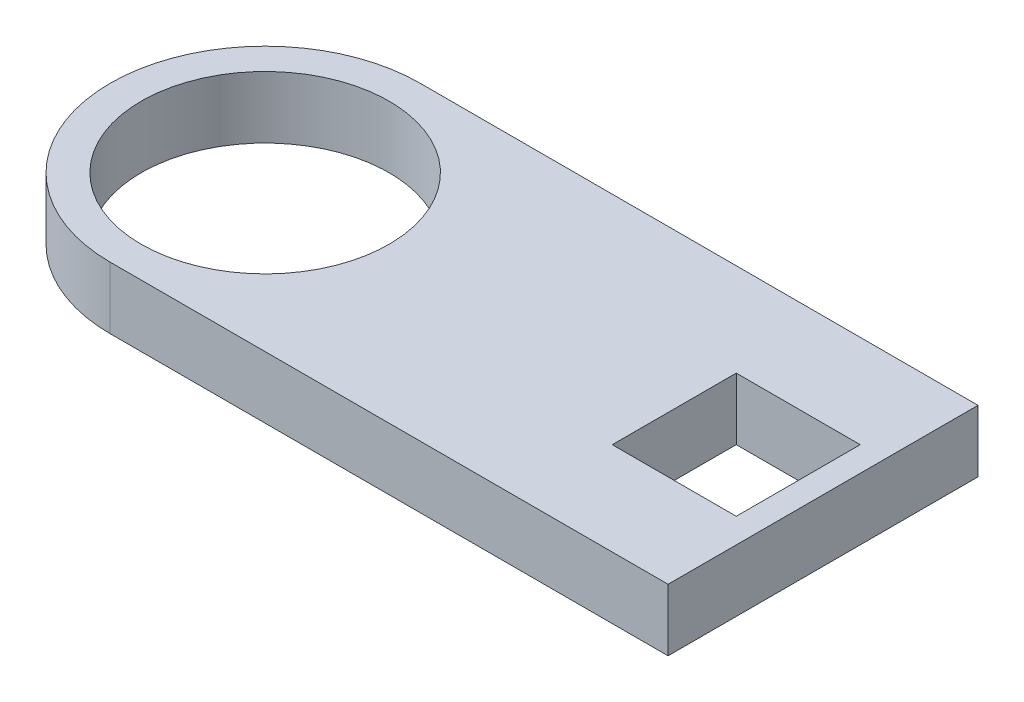
ISO-10303-21;
HEADER;
FILE_DESCRIPTION(('STEP AP214'),'2;1');
FILE_NAME('part.step','',(''),(''),'','','');
FILE_SCHEMA(('AUTOMOTIVE_DESIGN { 1 0 10303 214 1 1 1 1 }'));
ENDSEC;
DATA;
#1=APPLICATION_CONTEXT('core data for automotive mechanical design processes');
#2=APPLICATION_PROTOCOL_DEFINITION('international standard','automotive_design',2000,#1);
#3=PRODUCT_CONTEXT('',#1,'mechanical');
#4=PRODUCT('Part','Part','',(#3));
#5=PRODUCT_RELATED_PRODUCT_CATEGORY('part','',(#4));
#6=PRODUCT_DEFINITION_FORMATION('','',#4);
#7=PRODUCT_DEFINITION_CONTEXT('part definition',#1,'design');
#8=PRODUCT_DEFINITION('design','',#6,#7);
#9=PRODUCT_DEFINITION_SHAPE('','',#8);
#10=(LENGTH_UNIT() NAMED_UNIT(*) SI_UNIT(.MILLI.,.METRE.));
#11=(NAMED_UNIT(*) PLANE_ANGLE_UNIT() SI_UNIT($,.RADIAN.));
#12=(NAMED_UNIT(*) SI_UNIT($,.STERADIAN.) SOLID_ANGLE_UNIT());
#13=UNCERTAINTY_MEASURE_WITH_UNIT(LENGTH_MEASURE(1.E-05),#10,'distance_accuracy_value','');
#14=(GEOMETRIC_REPRESENTATION_CONTEXT(3) GLOBAL_UNCERTAINTY_ASSIGNED_CONTEXT((#13)) GLOBAL_UNIT_ASSIGNED_CONTEXT((#10,
#11,#12)) REPRESENTATION_CONTEXT('',''));
#15=CARTESIAN_POINT('',(0.,0.,0.));
#16=DIRECTION('',(0.,0.,1.));
#17=DIRECTION('',(1.,0.,0.));
#18=AXIS2_PLACEMENT_3D('',#15,#16,#17);
#19=CARTESIAN_POINT('',(0.,5.,-12.5));
#20=DIRECTION('',(0.,1.,0.));
#21=DIRECTION('',(0.,0.,1.));
#22=AXIS2_PLACEMENT_3D('',#19,#20,#21);
#23=PLANE('',#22);
#24=CARTESIAN_POINT('',(0.,5.,-12.5));
#25=DIRECTION('',(0.,1.,0.));
#26=DIRECTION('',(0.,0.,1.));
#27=AXIS2_PLACEMENT_3D('',#24,#25,#26);
#28=CIRCLE('',#27,12.5);
#29=CARTESIAN_POINT('',(0.,5.,-25.));
#30=VERTEX_POINT('',#29);
#31=CARTESIAN_POINT('',(0.,5.,0.));
#32=VERTEX_POINT('',#31);
#33=EDGE_CURVE('E140',#30,#32,#28,.T.);
#34=ORIENTED_EDGE('',*,*,#33,.T.);
#35=DIRECTION('',(1.,0.,0.));
#36=VECTOR('',#35,1.);
#37=CARTESIAN_POINT('',(0.,5.,0.));
#38=LINE('',#37,#36);
#39=CARTESIAN_POINT('',(45.,5.,0.));
#40=VERTEX_POINT('',#39);
#41=EDGE_CURVE('E143',#32,#40,#38,.T.);
#42=ORIENTED_EDGE('',*,*,#41,.T.);
#43=DIRECTION('',(0.,0.,-1.));
#44=VECTOR('',#43,1.);
#45=CARTESIAN_POINT('',(45.,5.,0.));
#46=LINE('',#45,#44);
#47=CARTESIAN_POINT('',(45.,5.,-25.));
#48=VERTEX_POINT('',#47);
#49=EDGE_CURVE('E146',#40,#48,#46,.T.);
#50=ORIENTED_EDGE('',*,*,#49,.T.);
#51=DIRECTION('',(-1.,0.,0.));
#52=VECTOR('',#51,1.);
#53=CARTESIAN_POINT('',(0.,5.,-25.));
#54=LINE('',#53,#52);
#55=EDGE_CURVE('E148',#48,#30,#54,.T.);
#56=ORIENTED_EDGE('',*,*,#55,.T.);
#57=EDGE_LOOP('',(#34,#42,#50,#56));
#58=FACE_BOUND('',#57,.T.);
#59=CARTESIAN_POINT('',(0.,5.,-12.5));
#60=DIRECTION('',(0.,1.,0.));
#61=DIRECTION('',(0.,0.,1.));
#62=AXIS2_PLACEMENT_3D('',#59,#60,#61);
#63=CIRCLE('',#62,10.);
#64=CARTESIAN_POINT('',(0.,5.,-2.5));
#65=VERTEX_POINT('',#64);
#66=EDGE_CURVE('E134',#65,#65,#63,.T.);
#67=ORIENTED_EDGE('',*,*,#66,.F.);
#68=EDGE_LOOP('',(#67));
#69=FACE_BOUND('',#68,.T.);
#70=DIRECTION('',(-1.,0.,0.));
#71=VECTOR('',#70,1.);
#72=CARTESIAN_POINT('',(43.,5.,-17.5));
#73=LINE('',#72,#71);
#74=CARTESIAN_POINT('',(43.,5.,-17.5));
#75=VERTEX_POINT('',#74);
#76=CARTESIAN_POINT('',(33.,5.,-17.5));
#77=VERTEX_POINT('',#76);
#78=EDGE_CURVE('E106',#75,#77,#73,.T.);
#79=ORIENTED_EDGE('',*,*,#78,.F.);
#80=DIRECTION('',(0.,0.,-1.));
#81=VECTOR('',#80,1.);
#82=CARTESIAN_POINT('',(43.,5.,-17.5));
#83=LINE('',#82,#81);
#84=CARTESIAN_POINT('',(43.,5.,-7.50000000000001));
#85=VERTEX_POINT('',#84);
#86=EDGE_CURVE('E98',#85,#75,#83,.T.);
#87=ORIENTED_EDGE('',*,*,#86,.F.);
#88=DIRECTION('',(1.,0.,0.));
#89=VECTOR('',#88,1.);
#90=CARTESIAN_POINT('',(43.,5.,-7.50000000000001));
#91=LINE('',#90,#89);
#92=CARTESIAN_POINT('',(33.,5.,-7.5));
#93=VERTEX_POINT('',#92);
#94=EDGE_CURVE('E120',#93,#85,#91,.T.);
#95=ORIENTED_EDGE('',*,*,#94,.F.);
#96=DIRECTION('',(0.,0.,1.));
#97=VECTOR('',#96,1.);
#98=CARTESIAN_POINT('',(33.,5.,-17.5));
#99=LINE('',#98,#97);
#100=EDGE_CURVE('E118',#77,#93,#99,.T.);
#101=ORIENTED_EDGE('',*,*,#100,.F.);
#102=EDGE_LOOP('',(#79,#87,#95,#101));
#103=FACE_BOUND('',#102,.T.);
#104=ADVANCED_FACE('F33',(#58,#69,#103),#23,.T.);
#105=CARTESIAN_POINT('',(0.,0.,-12.5));
#106=DIRECTION('',(0.,1.,0.));
#107=DIRECTION('',(0.,0.,1.));
#108=AXIS2_PLACEMENT_3D('',#105,#106,#107);
#109=PLANE('',#108);
#110=CARTESIAN_POINT('',(0.,0.,-12.5));
#111=DIRECTION('',(0.,1.,0.));
#112=DIRECTION('',(0.,0.,1.));
#113=AXIS2_PLACEMENT_3D('',#110,#111,#112);
#114=CIRCLE('',#113,10.);
#115=CARTESIAN_POINT('',(0.,0.,-2.5));
#116=VERTEX_POINT('',#115);
#117=EDGE_CURVE('E114',#116,#116,#114,.T.);
#118=ORIENTED_EDGE('',*,*,#117,.T.);
#119=EDGE_LOOP('',(#118));
#120=FACE_BOUND('',#119,.T.);
#121=CARTESIAN_POINT('',(0.,0.,-12.5));
#122=DIRECTION('',(0.,1.,0.));
#123=DIRECTION('',(0.,0.,1.));
#124=AXIS2_PLACEMENT_3D('',#121,#122,#123);
#125=CIRCLE('',#124,12.5);
#126=CARTESIAN_POINT('',(0.,0.,-25.));
#127=VERTEX_POINT('',#126);
#128=CARTESIAN_POINT('',(0.,0.,0.));
#129=VERTEX_POINT('',#128);
#130=EDGE_CURVE('E137',#127,#129,#125,.T.);
#131=ORIENTED_EDGE('',*,*,#130,.F.);
#132=DIRECTION('',(-1.,0.,0.));
#133=VECTOR('',#132,1.);
#134=CARTESIAN_POINT('',(0.,0.,-25.));
#135=LINE('',#134,#133);
#136=CARTESIAN_POINT('',(45.,0.,-25.));
#137=VERTEX_POINT('',#136);
#138=EDGE_CURVE('E144',#137,#127,#135,.T.);
#139=ORIENTED_EDGE('',*,*,#138,.F.);
#140=DIRECTION('',(0.,0.,-1.));
#141=VECTOR('',#140,1.);
#142=CARTESIAN_POINT('',(45.,0.,0.));
#143=LINE('',#142,#141);
#144=CARTESIAN_POINT('',(45.,0.,0.));
#145=VERTEX_POINT('',#144);
#146=EDGE_CURVE('E155',#145,#137,#143,.T.);
#147=ORIENTED_EDGE('',*,*,#146,.F.);
#148=DIRECTION('',(1.,0.,0.));
#149=VECTOR('',#148,1.);
#150=CARTESIAN_POINT('',(0.,0.,0.));
#151=LINE('',#150,#149);
#152=EDGE_CURVE('E153',#129,#145,#151,.T.);
#153=ORIENTED_EDGE('',*,*,#152,.F.);
#154=EDGE_LOOP('',(#131,#139,#147,#153));
#155=FACE_BOUND('',#154,.T.);
#156=DIRECTION('',(0.,0.,-1.));
#157=VECTOR('',#156,1.);
#158=CARTESIAN_POINT('',(43.,0.,-17.5));
#159=LINE('',#158,#157);
#160=CARTESIAN_POINT('',(43.,0.,-7.50000000000001));
#161=VERTEX_POINT('',#160);
#162=CARTESIAN_POINT('',(43.,0.,-17.5));
#163=VERTEX_POINT('',#162);
#164=EDGE_CURVE('E56',#161,#163,#159,.T.);
#165=ORIENTED_EDGE('',*,*,#164,.T.);
#166=DIRECTION('',(-1.,0.,0.));
#167=VECTOR('',#166,1.);
#168=CARTESIAN_POINT('',(43.,0.,-17.5));
#169=LINE('',#168,#167);
#170=CARTESIAN_POINT('',(33.,0.,-17.5));
#171=VERTEX_POINT('',#170);
#172=EDGE_CURVE('E113',#163,#171,#169,.T.);
#173=ORIENTED_EDGE('',*,*,#172,.T.);
#174=DIRECTION('',(0.,0.,1.));
#175=VECTOR('',#174,1.);
#176=CARTESIAN_POINT('',(33.,0.,-17.5));
#177=LINE('',#176,#175);
#178=CARTESIAN_POINT('',(33.,0.,-7.5));
#179=VERTEX_POINT('',#178);
#180=EDGE_CURVE('E126',#171,#179,#177,.T.);
#181=ORIENTED_EDGE('',*,*,#180,.T.);
#182=DIRECTION('',(1.,0.,0.));
#183=VECTOR('',#182,1.);
#184=CARTESIAN_POINT('',(43.,0.,-7.50000000000001));
#185=LINE('',#184,#183);
#186=EDGE_CURVE('E107',#179,#161,#185,.T.);
#187=ORIENTED_EDGE('',*,*,#186,.T.);
#188=EDGE_LOOP('',(#165,#173,#181,#187));
#189=FACE_BOUND('',#188,.T.);
#190=ADVANCED_FACE('F173',(#120,#155,#189),#109,.F.);
#191=CARTESIAN_POINT('',(0.,5.,-12.5));
#192=DIRECTION('',(0.,-1.,0.));
#193=DIRECTION('',(0.,0.,-1.));
#194=AXIS2_PLACEMENT_3D('',#191,#192,#193);
#195=CYLINDRICAL_SURFACE('',#194,12.5);
#196=ORIENTED_EDGE('',*,*,#130,.T.);
#197=DIRECTION('',(0.,-1.,0.));
#198=VECTOR('',#197,1.);
#199=CARTESIAN_POINT('',(0.,5.,0.));
#200=LINE('',#199,#198);
#201=EDGE_CURVE('E11',#32,#129,#200,.T.);
#202=ORIENTED_EDGE('',*,*,#201,.F.);
#203=ORIENTED_EDGE('',*,*,#33,.F.);
#204=DIRECTION('',(0.,-1.,0.));
#205=VECTOR('',#204,1.);
#206=CARTESIAN_POINT('',(0.,5.,-25.));
#207=LINE('',#206,#205);
#208=EDGE_CURVE('E150',#30,#127,#207,.T.);
#209=ORIENTED_EDGE('',*,*,#208,.T.);
#210=EDGE_LOOP('',(#196,#202,#203,#209));
#211=FACE_BOUND('',#210,.T.);
#212=ADVANCED_FACE('F35',(#211),#195,.T.);
#213=CARTESIAN_POINT('',(0.,5.,0.));
#214=DIRECTION('',(0.,0.,-1.));
#215=DIRECTION('',(-1.,0.,0.));
#216=AXIS2_PLACEMENT_3D('',#213,#214,#215);
#217=PLANE('',#216);
#218=ORIENTED_EDGE('',*,*,#152,.T.);
#219=DIRECTION('',(0.,-1.,0.));
#220=VECTOR('',#219,1.);
#221=CARTESIAN_POINT('',(45.,5.,0.));
#222=LINE('',#221,#220);
#223=EDGE_CURVE('E41',#40,#145,#222,.T.);
#224=ORIENTED_EDGE('',*,*,#223,.F.);
#225=ORIENTED_EDGE('',*,*,#41,.F.);
#226=ORIENTED_EDGE('',*,*,#201,.T.);
#227=EDGE_LOOP('',(#218,#224,#225,#226));
#228=FACE_BOUND('',#227,.T.);
#229=ADVANCED_FACE('F184',(#228),#217,.F.);
#230=CARTESIAN_POINT('',(45.,5.,0.));
#231=DIRECTION('',(-1.,0.,0.));
#232=DIRECTION('',(0.,0.,1.));
#233=AXIS2_PLACEMENT_3D('',#230,#231,#232);
#234=PLANE('',#233);
#235=ORIENTED_EDGE('',*,*,#146,.T.);
#236=DIRECTION('',(0.,-1.,0.));
#237=VECTOR('',#236,1.);
#238=CARTESIAN_POINT('',(45.,5.,-25.));
#239=LINE('',#238,#237);
#240=EDGE_CURVE('E160',#48,#137,#239,.T.);
#241=ORIENTED_EDGE('',*,*,#240,.F.);
#242=ORIENTED_EDGE('',*,*,#49,.F.);
#243=ORIENTED_EDGE('',*,*,#223,.T.);
#244=EDGE_LOOP('',(#235,#241,#242,#243));
#245=FACE_BOUND('',#244,.T.);
#246=ADVANCED_FACE('F167',(#245),#234,.F.);
#247=CARTESIAN_POINT('',(0.,5.,-25.));
#248=DIRECTION('',(0.,0.,1.));
#249=DIRECTION('',(1.,0.,0.));
#250=AXIS2_PLACEMENT_3D('',#247,#248,#249);
#251=PLANE('',#250);
#252=ORIENTED_EDGE('',*,*,#138,.T.);
#253=ORIENTED_EDGE('',*,*,#208,.F.);
#254=ORIENTED_EDGE('',*,*,#55,.F.);
#255=ORIENTED_EDGE('',*,*,#240,.T.);
#256=EDGE_LOOP('',(#252,#253,#254,#255));
#257=FACE_BOUND('',#256,.T.);
#258=ADVANCED_FACE('F177',(#257),#251,.F.);
#259=CARTESIAN_POINT('',(0.,5.,-12.5));
#260=DIRECTION('',(0.,-1.,0.));
#261=DIRECTION('',(0.,0.,-1.));
#262=AXIS2_PLACEMENT_3D('',#259,#260,#261);
#263=CYLINDRICAL_SURFACE('',#262,10.);
#264=ORIENTED_EDGE('',*,*,#66,.T.);
#265=EDGE_LOOP('',(#264));
#266=FACE_BOUND('',#265,.T.);
#267=ORIENTED_EDGE('',*,*,#117,.F.);
#268=EDGE_LOOP('',(#267));
#269=FACE_BOUND('',#268,.T.);
#270=ADVANCED_FACE('F199',(#266,#269),#263,.F.);
#271=CARTESIAN_POINT('',(43.,5.,-17.5));
#272=DIRECTION('',(-1.,0.,0.));
#273=DIRECTION('',(0.,0.,1.));
#274=AXIS2_PLACEMENT_3D('',#271,#272,#273);
#275=PLANE('',#274);
#276=ORIENTED_EDGE('',*,*,#164,.F.);
#277=DIRECTION('',(0.,-1.,0.));
#278=VECTOR('',#277,1.);
#279=CARTESIAN_POINT('',(43.,5.,-7.50000000000001));
#280=LINE('',#279,#278);
#281=EDGE_CURVE('E102',#85,#161,#280,.T.);
#282=ORIENTED_EDGE('',*,*,#281,.F.);
#283=ORIENTED_EDGE('',*,*,#86,.T.);
#284=DIRECTION('',(0.,-1.,0.));
#285=VECTOR('',#284,1.);
#286=CARTESIAN_POINT('',(43.,5.,-17.5));
#287=LINE('',#286,#285);
#288=EDGE_CURVE('E101',#75,#163,#287,.T.);
#289=ORIENTED_EDGE('',*,*,#288,.T.);
#290=EDGE_LOOP('',(#276,#282,#283,#289));
#291=FACE_BOUND('',#290,.T.);
#292=ADVANCED_FACE('F100',(#291),#275,.T.);
#293=CARTESIAN_POINT('',(43.,5.,-17.5));
#294=DIRECTION('',(0.,0.,1.));
#295=DIRECTION('',(1.,0.,0.));
#296=AXIS2_PLACEMENT_3D('',#293,#294,#295);
#297=PLANE('',#296);
#298=ORIENTED_EDGE('',*,*,#172,.F.);
#299=ORIENTED_EDGE('',*,*,#288,.F.);
#300=ORIENTED_EDGE('',*,*,#78,.T.);
#301=DIRECTION('',(0.,-1.,0.));
#302=VECTOR('',#301,1.);
#303=CARTESIAN_POINT('',(33.,5.,-17.5));
#304=LINE('',#303,#302);
#305=EDGE_CURVE('E115',#77,#171,#304,.T.);
#306=ORIENTED_EDGE('',*,*,#305,.T.);
#307=EDGE_LOOP('',(#298,#299,#300,#306));
#308=FACE_BOUND('',#307,.T.);
#309=ADVANCED_FACE('F110',(#308),#297,.T.);
#310=CARTESIAN_POINT('',(33.,5.,-17.5));
#311=DIRECTION('',(1.,0.,0.));
#312=DIRECTION('',(0.,0.,-1.));
#313=AXIS2_PLACEMENT_3D('',#310,#311,#312);
#314=PLANE('',#313);
#315=ORIENTED_EDGE('',*,*,#180,.F.);
#316=ORIENTED_EDGE('',*,*,#305,.F.);
#317=ORIENTED_EDGE('',*,*,#100,.T.);
#318=DIRECTION('',(0.,-1.,0.));
#319=VECTOR('',#318,1.);
#320=CARTESIAN_POINT('',(33.,5.,-7.5));
#321=LINE('',#320,#319);
#322=EDGE_CURVE('E48',#93,#179,#321,.T.);
#323=ORIENTED_EDGE('',*,*,#322,.T.);
#324=EDGE_LOOP('',(#315,#316,#317,#323));
#325=FACE_BOUND('',#324,.T.);
#326=ADVANCED_FACE('F216',(#325),#314,.T.);
#327=CARTESIAN_POINT('',(43.,5.,-7.50000000000001));
#328=DIRECTION('',(0.,0.,-1.));
#329=DIRECTION('',(-1.,0.,0.));
#330=AXIS2_PLACEMENT_3D('',#327,#328,#329);
#331=PLANE('',#330);
#332=ORIENTED_EDGE('',*,*,#186,.F.);
#333=ORIENTED_EDGE('',*,*,#322,.F.);
#334=ORIENTED_EDGE('',*,*,#94,.T.);
#335=ORIENTED_EDGE('',*,*,#281,.T.);
#336=EDGE_LOOP('',(#332,#333,#334,#335));
#337=FACE_BOUND('',#336,.T.);
#338=ADVANCED_FACE('F221',(#337),#331,.T.);
#339=CLOSED_SHELL('',(#104,#190,#212,#229,#246,#258,#270,#292,#309,#326,#338));
#340=MANIFOLD_SOLID_BREP('B2',#339);
#341=ADVANCED_BREP_SHAPE_REPRESENTATION('',(#18,#340),#14);
#342=SHAPE_DEFINITION_REPRESENTATION(#9,#341);
ENDSEC;
END-ISO-10303-21;
